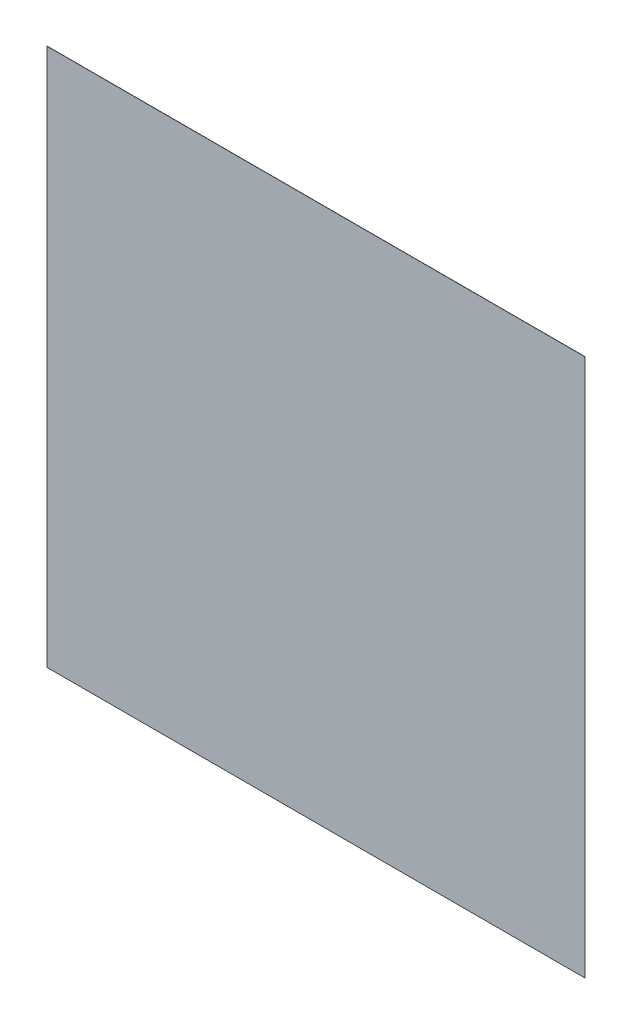
ISO-10303-21;
HEADER;
FILE_DESCRIPTION(('STEP AP214'),'2;1');
FILE_NAME('part.step','',(''),(''),'','','');
FILE_SCHEMA(('AUTOMOTIVE_DESIGN { 1 0 10303 214 1 1 1 1 }'));
ENDSEC;
DATA;
#1=APPLICATION_CONTEXT('core data for automotive mechanical design processes');
#2=APPLICATION_PROTOCOL_DEFINITION('international standard','automotive_design',2000,#1);
#3=PRODUCT_CONTEXT('',#1,'mechanical');
#4=PRODUCT('Part','Part','',(#3));
#5=PRODUCT_RELATED_PRODUCT_CATEGORY('part','',(#4));
#6=PRODUCT_DEFINITION_FORMATION('','',#4);
#7=PRODUCT_DEFINITION_CONTEXT('part definition',#1,'design');
#8=PRODUCT_DEFINITION('design','',#6,#7);
#9=PRODUCT_DEFINITION_SHAPE('','',#8);
#10=(LENGTH_UNIT() NAMED_UNIT(*) SI_UNIT(.MILLI.,.METRE.));
#11=(NAMED_UNIT(*) PLANE_ANGLE_UNIT() SI_UNIT($,.RADIAN.));
#12=(NAMED_UNIT(*) SI_UNIT($,.STERADIAN.) SOLID_ANGLE_UNIT());
#13=UNCERTAINTY_MEASURE_WITH_UNIT(LENGTH_MEASURE(1.E-05),#10,'distance_accuracy_value','');
#14=(GEOMETRIC_REPRESENTATION_CONTEXT(3) GLOBAL_UNCERTAINTY_ASSIGNED_CONTEXT((#13)) GLOBAL_UNIT_ASSIGNED_CONTEXT((#10,
#11,#12)) REPRESENTATION_CONTEXT('',''));
#15=CARTESIAN_POINT('',(0.,0.,0.));
#16=DIRECTION('',(0.,0.,1.));
#17=DIRECTION('',(1.,0.,0.));
#18=AXIS2_PLACEMENT_3D('',#15,#16,#17);
#19=CARTESIAN_POINT('',(-150.,150.,0.1));
#20=DIRECTION('',(1.,0.,0.));
#21=DIRECTION('',(0.,0.,-1.));
#22=AXIS2_PLACEMENT_3D('',#19,#20,#21);
#23=PLANE('',#22);
#24=DIRECTION('',(0.,-1.,0.));
#25=VECTOR('',#24,1.);
#26=CARTESIAN_POINT('',(-150.,150.,0.));
#27=LINE('',#26,#25);
#28=CARTESIAN_POINT('',(-150.,150.,0.));
#29=VERTEX_POINT('',#28);
#30=CARTESIAN_POINT('',(-150.,-150.,0.));
#31=VERTEX_POINT('',#30);
#32=EDGE_CURVE('E97',#29,#31,#27,.T.);
#33=ORIENTED_EDGE('',*,*,#32,.T.);
#34=DIRECTION('',(0.,0.,-1.));
#35=VECTOR('',#34,1.);
#36=CARTESIAN_POINT('',(-150.,-150.,0.1));
#37=LINE('',#36,#35);
#38=CARTESIAN_POINT('',(-150.,-150.,0.1));
#39=VERTEX_POINT('',#38);
#40=EDGE_CURVE('E11',#39,#31,#37,.T.);
#41=ORIENTED_EDGE('',*,*,#40,.F.);
#42=DIRECTION('',(0.,-1.,0.));
#43=VECTOR('',#42,1.);
#44=CARTESIAN_POINT('',(-150.,150.,0.1));
#45=LINE('',#44,#43);
#46=CARTESIAN_POINT('',(-150.,150.,0.1));
#47=VERTEX_POINT('',#46);
#48=EDGE_CURVE('E85',#47,#39,#45,.T.);
#49=ORIENTED_EDGE('',*,*,#48,.F.);
#50=DIRECTION('',(0.,0.,-1.));
#51=VECTOR('',#50,1.);
#52=CARTESIAN_POINT('',(-150.,150.,0.1));
#53=LINE('',#52,#51);
#54=EDGE_CURVE('E93',#47,#29,#53,.T.);
#55=ORIENTED_EDGE('',*,*,#54,.T.);
#56=EDGE_LOOP('',(#33,#41,#49,#55));
#57=FACE_BOUND('',#56,.T.);
#58=ADVANCED_FACE('F34',(#57),#23,.F.);
#59=CARTESIAN_POINT('',(-150.,-150.,0.1));
#60=DIRECTION('',(0.,1.,0.));
#61=DIRECTION('',(-1.,0.,0.));
#62=AXIS2_PLACEMENT_3D('',#59,#60,#61);
#63=PLANE('',#62);
#64=DIRECTION('',(1.,0.,0.));
#65=VECTOR('',#64,1.);
#66=CARTESIAN_POINT('',(-150.,-150.,0.));
#67=LINE('',#66,#65);
#68=CARTESIAN_POINT('',(150.,-150.,0.));
#69=VERTEX_POINT('',#68);
#70=EDGE_CURVE('E89',#31,#69,#67,.T.);
#71=ORIENTED_EDGE('',*,*,#70,.T.);
#72=DIRECTION('',(0.,0.,-1.));
#73=VECTOR('',#72,1.);
#74=CARTESIAN_POINT('',(150.,-150.,0.1));
#75=LINE('',#74,#73);
#76=CARTESIAN_POINT('',(150.,-150.,0.1));
#77=VERTEX_POINT('',#76);
#78=EDGE_CURVE('E42',#77,#69,#75,.T.);
#79=ORIENTED_EDGE('',*,*,#78,.F.);
#80=DIRECTION('',(1.,0.,0.));
#81=VECTOR('',#80,1.);
#82=CARTESIAN_POINT('',(-150.,-150.,0.1));
#83=LINE('',#82,#81);
#84=EDGE_CURVE('E80',#39,#77,#83,.T.);
#85=ORIENTED_EDGE('',*,*,#84,.F.);
#86=ORIENTED_EDGE('',*,*,#40,.T.);
#87=EDGE_LOOP('',(#71,#79,#85,#86));
#88=FACE_BOUND('',#87,.T.);
#89=ADVANCED_FACE('F88',(#88),#63,.F.);
#90=CARTESIAN_POINT('',(150.,150.,0.1));
#91=DIRECTION('',(-1.,0.,0.));
#92=DIRECTION('',(0.,0.,1.));
#93=AXIS2_PLACEMENT_3D('',#90,#91,#92);
#94=PLANE('',#93);
#95=DIRECTION('',(0.,1.,0.));
#96=VECTOR('',#95,1.);
#97=CARTESIAN_POINT('',(150.,150.,0.));
#98=LINE('',#97,#96);
#99=CARTESIAN_POINT('',(150.,150.,0.));
#100=VERTEX_POINT('',#99);
#101=EDGE_CURVE('E67',#69,#100,#98,.T.);
#102=ORIENTED_EDGE('',*,*,#101,.T.);
#103=DIRECTION('',(0.,0.,-1.));
#104=VECTOR('',#103,1.);
#105=CARTESIAN_POINT('',(150.,150.,0.1));
#106=LINE('',#105,#104);
#107=CARTESIAN_POINT('',(150.,150.,0.1));
#108=VERTEX_POINT('',#107);
#109=EDGE_CURVE('E90',#108,#100,#106,.T.);
#110=ORIENTED_EDGE('',*,*,#109,.F.);
#111=DIRECTION('',(0.,1.,0.));
#112=VECTOR('',#111,1.);
#113=CARTESIAN_POINT('',(150.,150.,0.1));
#114=LINE('',#113,#112);
#115=EDGE_CURVE('E83',#77,#108,#114,.T.);
#116=ORIENTED_EDGE('',*,*,#115,.F.);
#117=ORIENTED_EDGE('',*,*,#78,.T.);
#118=EDGE_LOOP('',(#102,#110,#116,#117));
#119=FACE_BOUND('',#118,.T.);
#120=ADVANCED_FACE('F91',(#119),#94,.F.);
#121=CARTESIAN_POINT('',(-150.,150.,0.1));
#122=DIRECTION('',(0.,-1.,0.));
#123=DIRECTION('',(1.,0.,0.));
#124=AXIS2_PLACEMENT_3D('',#121,#122,#123);
#125=PLANE('',#124);
#126=DIRECTION('',(-1.,0.,0.));
#127=VECTOR('',#126,1.);
#128=CARTESIAN_POINT('',(-150.,150.,0.));
#129=LINE('',#128,#127);
#130=EDGE_CURVE('E73',#100,#29,#129,.T.);
#131=ORIENTED_EDGE('',*,*,#130,.T.);
#132=ORIENTED_EDGE('',*,*,#54,.F.);
#133=DIRECTION('',(-1.,0.,0.));
#134=VECTOR('',#133,1.);
#135=CARTESIAN_POINT('',(-150.,150.,0.1));
#136=LINE('',#135,#134);
#137=EDGE_CURVE('E50',#108,#47,#136,.T.);
#138=ORIENTED_EDGE('',*,*,#137,.F.);
#139=ORIENTED_EDGE('',*,*,#109,.T.);
#140=EDGE_LOOP('',(#131,#132,#138,#139));
#141=FACE_BOUND('',#140,.T.);
#142=ADVANCED_FACE('F104',(#141),#125,.F.);
#143=CARTESIAN_POINT('',(0.,0.,0.1));
#144=DIRECTION('',(0.,0.,1.));
#145=DIRECTION('',(1.,0.,0.));
#146=AXIS2_PLACEMENT_3D('',#143,#144,#145);
#147=PLANE('',#146);
#148=ORIENTED_EDGE('',*,*,#48,.T.);
#149=ORIENTED_EDGE('',*,*,#84,.T.);
#150=ORIENTED_EDGE('',*,*,#115,.T.);
#151=ORIENTED_EDGE('',*,*,#137,.T.);
#152=EDGE_LOOP('',(#148,#149,#150,#151));
#153=FACE_BOUND('',#152,.T.);
#154=ADVANCED_FACE('F81',(#153),#147,.T.);
#155=CARTESIAN_POINT('',(0.,0.,0.));
#156=DIRECTION('',(0.,0.,1.));
#157=DIRECTION('',(1.,0.,0.));
#158=AXIS2_PLACEMENT_3D('',#155,#156,#157);
#159=PLANE('',#158);
#160=ORIENTED_EDGE('',*,*,#32,.F.);
#161=ORIENTED_EDGE('',*,*,#130,.F.);
#162=ORIENTED_EDGE('',*,*,#101,.F.);
#163=ORIENTED_EDGE('',*,*,#70,.F.);
#164=EDGE_LOOP('',(#160,#161,#162,#163));
#165=FACE_BOUND('',#164,.T.);
#166=ADVANCED_FACE('F107',(#165),#159,.F.);
#167=CLOSED_SHELL('',(#58,#89,#120,#142,#154,#166));
#168=MANIFOLD_SOLID_BREP('B2',#167);
#169=ADVANCED_BREP_SHAPE_REPRESENTATION('',(#18,#168),#14);
#170=SHAPE_DEFINITION_REPRESENTATION(#9,#169);
ENDSEC;
END-ISO-10303-21;
